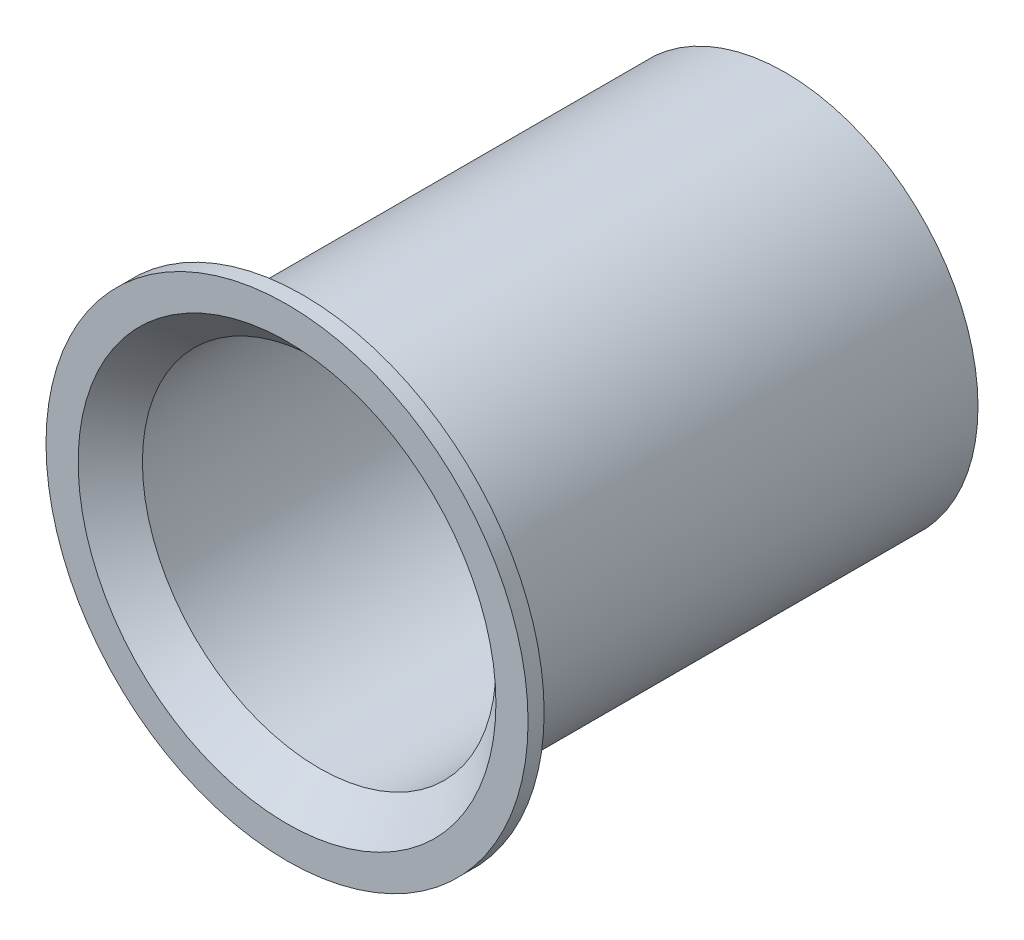
ISO-10303-21;
HEADER;
FILE_DESCRIPTION(('STEP AP214'),'2;1');
FILE_NAME('part.step','',(''),(''),'','','');
FILE_SCHEMA(('AUTOMOTIVE_DESIGN { 1 0 10303 214 1 1 1 1 }'));
ENDSEC;
DATA;
#1=APPLICATION_CONTEXT('core data for automotive mechanical design processes');
#2=APPLICATION_PROTOCOL_DEFINITION('international standard','automotive_design',2000,#1);
#3=PRODUCT_CONTEXT('',#1,'mechanical');
#4=PRODUCT('Part','Part','',(#3));
#5=PRODUCT_RELATED_PRODUCT_CATEGORY('part','',(#4));
#6=PRODUCT_DEFINITION_FORMATION('','',#4);
#7=PRODUCT_DEFINITION_CONTEXT('part definition',#1,'design');
#8=PRODUCT_DEFINITION('design','',#6,#7);
#9=PRODUCT_DEFINITION_SHAPE('','',#8);
#10=(LENGTH_UNIT() NAMED_UNIT(*) SI_UNIT(.MILLI.,.METRE.));
#11=(NAMED_UNIT(*) PLANE_ANGLE_UNIT() SI_UNIT($,.RADIAN.));
#12=(NAMED_UNIT(*) SI_UNIT($,.STERADIAN.) SOLID_ANGLE_UNIT());
#13=UNCERTAINTY_MEASURE_WITH_UNIT(LENGTH_MEASURE(1.E-05),#10,'distance_accuracy_value','');
#14=(GEOMETRIC_REPRESENTATION_CONTEXT(3) GLOBAL_UNCERTAINTY_ASSIGNED_CONTEXT((#13)) GLOBAL_UNIT_ASSIGNED_CONTEXT((#10,
#11,#12)) REPRESENTATION_CONTEXT('',''));
#15=CARTESIAN_POINT('',(0.,0.,0.));
#16=DIRECTION('',(0.,0.,1.));
#17=DIRECTION('',(1.,0.,0.));
#18=AXIS2_PLACEMENT_3D('',#15,#16,#17);
#19=CARTESIAN_POINT('',(0.,0.,0.5));
#20=DIRECTION('',(0.,0.,-1.));
#21=DIRECTION('',(-1.,0.,0.));
#22=AXIS2_PLACEMENT_3D('',#19,#20,#21);
#23=CYLINDRICAL_SURFACE('',#22,7.5);
#24=CARTESIAN_POINT('',(0.,0.,0.5));
#25=DIRECTION('',(0.,0.,1.));
#26=DIRECTION('',(1.,0.,0.));
#27=AXIS2_PLACEMENT_3D('',#24,#25,#26);
#28=CIRCLE('',#27,7.5);
#29=CARTESIAN_POINT('',(7.5,0.,0.5));
#30=VERTEX_POINT('',#29);
#31=EDGE_CURVE('E63',#30,#30,#28,.T.);
#32=ORIENTED_EDGE('',*,*,#31,.F.);
#33=EDGE_LOOP('',(#32));
#34=FACE_BOUND('',#33,.T.);
#35=CARTESIAN_POINT('',(0.,0.,0.));
#36=DIRECTION('',(0.,0.,1.));
#37=DIRECTION('',(1.,0.,0.));
#38=AXIS2_PLACEMENT_3D('',#35,#36,#37);
#39=CIRCLE('',#38,7.5);
#40=CARTESIAN_POINT('',(7.5,0.,0.));
#41=VERTEX_POINT('',#40);
#42=EDGE_CURVE('E64',#41,#41,#39,.T.);
#43=ORIENTED_EDGE('',*,*,#42,.T.);
#44=EDGE_LOOP('',(#43));
#45=FACE_BOUND('',#44,.T.);
#46=ADVANCED_FACE('F38',(#34,#45),#23,.T.);
#47=CARTESIAN_POINT('',(0.,0.,0.5));
#48=DIRECTION('',(0.,0.,1.));
#49=DIRECTION('',(1.,0.,0.));
#50=AXIS2_PLACEMENT_3D('',#47,#48,#49);
#51=PLANE('',#50);
#52=CARTESIAN_POINT('',(0.,0.,0.5));
#53=DIRECTION('',(0.,0.,1.));
#54=DIRECTION('',(1.,0.,0.));
#55=AXIS2_PLACEMENT_3D('',#52,#53,#54);
#56=CIRCLE('',#55,6.5);
#57=CARTESIAN_POINT('',(6.5,0.,0.5));
#58=VERTEX_POINT('',#57);
#59=EDGE_CURVE('E52',#58,#58,#56,.F.);
#60=ORIENTED_EDGE('',*,*,#59,.T.);
#61=EDGE_LOOP('',(#60));
#62=FACE_BOUND('',#61,.T.);
#63=ORIENTED_EDGE('',*,*,#31,.T.);
#64=EDGE_LOOP('',(#63));
#65=FACE_BOUND('',#64,.T.);
#66=ADVANCED_FACE('F98',(#62,#65),#51,.T.);
#67=CARTESIAN_POINT('',(0.,0.,0.));
#68=DIRECTION('',(0.,0.,1.));
#69=DIRECTION('',(1.,0.,0.));
#70=AXIS2_PLACEMENT_3D('',#67,#68,#69);
#71=PLANE('',#70);
#72=CARTESIAN_POINT('',(0.,0.,0.));
#73=DIRECTION('',(0.,0.,1.));
#74=DIRECTION('',(1.,0.,0.));
#75=AXIS2_PLACEMENT_3D('',#72,#73,#74);
#76=CIRCLE('',#75,6.99999999999999);
#77=CARTESIAN_POINT('',(6.99999999999999,0.,0.));
#78=VERTEX_POINT('',#77);
#79=EDGE_CURVE('E10',#78,#78,#76,.T.);
#80=ORIENTED_EDGE('',*,*,#79,.T.);
#81=EDGE_LOOP('',(#80));
#82=FACE_BOUND('',#81,.T.);
#83=ORIENTED_EDGE('',*,*,#42,.F.);
#84=EDGE_LOOP('',(#83));
#85=FACE_BOUND('',#84,.T.);
#86=ADVANCED_FACE('F105',(#82,#85),#71,.F.);
#87=CARTESIAN_POINT('',(0.,0.,-15.));
#88=DIRECTION('',(0.,0.,1.));
#89=DIRECTION('',(1.,0.,0.));
#90=AXIS2_PLACEMENT_3D('',#87,#88,#89);
#91=CYLINDRICAL_SURFACE('',#90,6.);
#92=CARTESIAN_POINT('',(0.,0.,-1.));
#93=DIRECTION('',(0.,0.,1.));
#94=DIRECTION('',(1.,0.,0.));
#95=AXIS2_PLACEMENT_3D('',#92,#93,#94);
#96=CIRCLE('',#95,6.);
#97=CARTESIAN_POINT('',(6.,0.,-1.));
#98=VERTEX_POINT('',#97);
#99=EDGE_CURVE('E47',#98,#98,#96,.F.);
#100=ORIENTED_EDGE('',*,*,#99,.T.);
#101=EDGE_LOOP('',(#100));
#102=FACE_BOUND('',#101,.T.);
#103=CARTESIAN_POINT('',(0.,0.,-15.));
#104=DIRECTION('',(0.,0.,-1.));
#105=DIRECTION('',(-1.,0.,0.));
#106=AXIS2_PLACEMENT_3D('',#103,#104,#105);
#107=CIRCLE('',#106,6.);
#108=CARTESIAN_POINT('',(-6.,0.,-15.));
#109=VERTEX_POINT('',#108);
#110=EDGE_CURVE('E68',#109,#109,#107,.T.);
#111=ORIENTED_EDGE('',*,*,#110,.F.);
#112=EDGE_LOOP('',(#111));
#113=FACE_BOUND('',#112,.T.);
#114=ADVANCED_FACE('F95',(#102,#113),#91,.T.);
#115=CARTESIAN_POINT('',(0.,0.,-15.));
#116=DIRECTION('',(0.,0.,-1.));
#117=DIRECTION('',(-1.,0.,0.));
#118=AXIS2_PLACEMENT_3D('',#115,#116,#117);
#119=PLANE('',#118);
#120=CARTESIAN_POINT('',(0.,0.,-15.));
#121=DIRECTION('',(0.,0.,1.));
#122=DIRECTION('',(1.,0.,0.));
#123=AXIS2_PLACEMENT_3D('',#120,#121,#122);
#124=CIRCLE('',#123,5.5);
#125=CARTESIAN_POINT('',(5.5,0.,-15.));
#126=VERTEX_POINT('',#125);
#127=EDGE_CURVE('E75',#126,#126,#124,.T.);
#128=ORIENTED_EDGE('',*,*,#127,.T.);
#129=EDGE_LOOP('',(#128));
#130=FACE_BOUND('',#129,.T.);
#131=ORIENTED_EDGE('',*,*,#110,.T.);
#132=EDGE_LOOP('',(#131));
#133=FACE_BOUND('',#132,.T.);
#134=ADVANCED_FACE('F80',(#130,#133),#119,.T.);
#135=CARTESIAN_POINT('',(0.,0.,-15.));
#136=DIRECTION('',(0.,0.,1.));
#137=DIRECTION('',(1.,0.,0.));
#138=AXIS2_PLACEMENT_3D('',#135,#136,#137);
#139=CYLINDRICAL_SURFACE('',#138,5.5);
#140=CARTESIAN_POINT('',(0.,0.,-0.499999999999994));
#141=DIRECTION('',(0.,0.,1.));
#142=DIRECTION('',(1.,0.,0.));
#143=AXIS2_PLACEMENT_3D('',#140,#141,#142);
#144=CIRCLE('',#143,5.5);
#145=CARTESIAN_POINT('',(5.5,0.,-0.499999999999994));
#146=VERTEX_POINT('',#145);
#147=EDGE_CURVE('E57',#146,#146,#144,.T.);
#148=ORIENTED_EDGE('',*,*,#147,.T.);
#149=EDGE_LOOP('',(#148));
#150=FACE_BOUND('',#149,.T.);
#151=ORIENTED_EDGE('',*,*,#127,.F.);
#152=EDGE_LOOP('',(#151));
#153=FACE_BOUND('',#152,.T.);
#154=ADVANCED_FACE('F83',(#150,#153),#139,.F.);
#155=CARTESIAN_POINT('',(0.,0.,-0.499999999999994));
#156=DIRECTION('',(0.,0.,1.));
#157=DIRECTION('',(1.,0.,0.));
#158=AXIS2_PLACEMENT_3D('',#155,#156,#157);
#159=CONICAL_SURFACE('',#158,5.5,0.785398163397451);
#160=ORIENTED_EDGE('',*,*,#59,.F.);
#161=EDGE_LOOP('',(#160));
#162=FACE_BOUND('',#161,.T.);
#163=ORIENTED_EDGE('',*,*,#147,.F.);
#164=EDGE_LOOP('',(#163));
#165=FACE_BOUND('',#164,.T.);
#166=ADVANCED_FACE('F85',(#162,#165),#159,.F.);
#167=CARTESIAN_POINT('',(0.,0.,-1.));
#168=DIRECTION('',(0.,0.,1.));
#169=DIRECTION('',(1.,0.,0.));
#170=AXIS2_PLACEMENT_3D('',#167,#168,#169);
#171=CONICAL_SURFACE('',#170,6.,0.785398163397443);
#172=ORIENTED_EDGE('',*,*,#79,.F.);
#173=EDGE_LOOP('',(#172));
#174=FACE_BOUND('',#173,.T.);
#175=ORIENTED_EDGE('',*,*,#99,.F.);
#176=EDGE_LOOP('',(#175));
#177=FACE_BOUND('',#176,.T.);
#178=ADVANCED_FACE('F41',(#174,#177),#171,.T.);
#179=CLOSED_SHELL('',(#46,#66,#86,#114,#134,#154,#166,#178));
#180=MANIFOLD_SOLID_BREP('B2',#179);
#181=ADVANCED_BREP_SHAPE_REPRESENTATION('',(#18,#180),#14);
#182=SHAPE_DEFINITION_REPRESENTATION(#9,#181);
ENDSEC;
END-ISO-10303-21;
